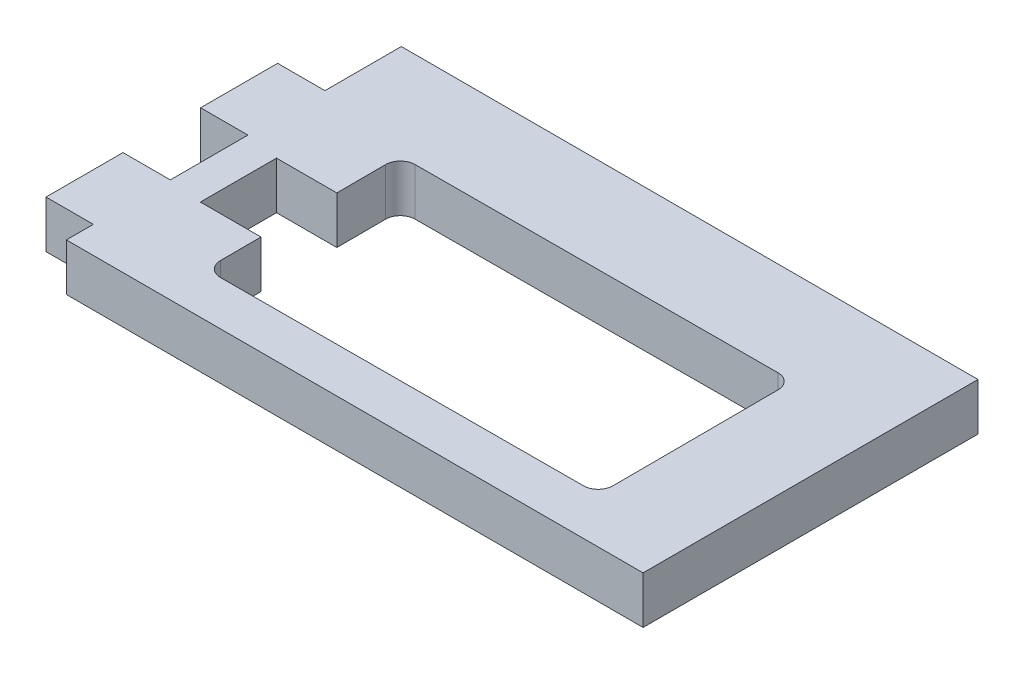
ISO-10303-21;
HEADER;
FILE_DESCRIPTION(('STEP AP214'),'2;1');
FILE_NAME('part.step','',(''),(''),'','','');
FILE_SCHEMA(('AUTOMOTIVE_DESIGN { 1 0 10303 214 1 1 1 1 }'));
ENDSEC;
DATA;
#1=APPLICATION_CONTEXT('core data for automotive mechanical design processes');
#2=APPLICATION_PROTOCOL_DEFINITION('international standard','automotive_design',2000,#1);
#3=PRODUCT_CONTEXT('',#1,'mechanical');
#4=PRODUCT('Part','Part','',(#3));
#5=PRODUCT_RELATED_PRODUCT_CATEGORY('part','',(#4));
#6=PRODUCT_DEFINITION_FORMATION('','',#4);
#7=PRODUCT_DEFINITION_CONTEXT('part definition',#1,'design');
#8=PRODUCT_DEFINITION('design','',#6,#7);
#9=PRODUCT_DEFINITION_SHAPE('','',#8);
#10=(LENGTH_UNIT() NAMED_UNIT(*) SI_UNIT(.MILLI.,.METRE.));
#11=(NAMED_UNIT(*) PLANE_ANGLE_UNIT() SI_UNIT($,.RADIAN.));
#12=(NAMED_UNIT(*) SI_UNIT($,.STERADIAN.) SOLID_ANGLE_UNIT());
#13=UNCERTAINTY_MEASURE_WITH_UNIT(LENGTH_MEASURE(1.E-05),#10,'distance_accuracy_value','');
#14=(GEOMETRIC_REPRESENTATION_CONTEXT(3) GLOBAL_UNCERTAINTY_ASSIGNED_CONTEXT((#13)) GLOBAL_UNIT_ASSIGNED_CONTEXT((#10,
#11,#12)) REPRESENTATION_CONTEXT('',''));
#15=CARTESIAN_POINT('',(0.,0.,0.));
#16=DIRECTION('',(0.,0.,1.));
#17=DIRECTION('',(1.,0.,0.));
#18=AXIS2_PLACEMENT_3D('',#15,#16,#17);
#19=CARTESIAN_POINT('',(60.7145244467132,0.,-0.194520655128441));
#20=DIRECTION('',(-0.999994867689621,0.,0.00320384057292232));
#21=DIRECTION('',(0.00320384057292232,0.,0.999994867689621));
#22=AXIS2_PLACEMENT_3D('',#19,#20,#21);
#23=PLANE('',#22);
#24=DIRECTION('',(0.00320384057292232,0.,0.999994867689622));
#25=VECTOR('',#24,1.);
#26=CARTESIAN_POINT('',(60.7145244467132,4.800000052,-0.194520655128441));
#27=LINE('',#26,#25);
#28=CARTESIAN_POINT('',(60.5113491104822,4.800000052,-63.6103769837103));
#29=VERTEX_POINT('',#28);
#30=CARTESIAN_POINT('',(60.5272366412184,4.800000052,-58.6515006492368));
#31=VERTEX_POINT('',#30);
#32=EDGE_CURVE('E277',#29,#31,#27,.T.);
#33=ORIENTED_EDGE('',*,*,#32,.T.);
#34=DIRECTION('',(0.,-1.,0.));
#35=VECTOR('',#34,1.);
#36=CARTESIAN_POINT('',(60.5272366412184,0.,-58.6515006492368));
#37=LINE('',#36,#35);
#38=CARTESIAN_POINT('',(60.5272366412184,0.,-58.6515006492368));
#39=VERTEX_POINT('',#38);
#40=EDGE_CURVE('E11',#31,#39,#37,.T.);
#41=ORIENTED_EDGE('',*,*,#40,.T.);
#42=DIRECTION('',(0.00320384057292232,0.,0.999994867689622));
#43=VECTOR('',#42,1.);
#44=CARTESIAN_POINT('',(60.7145244467132,0.,-0.194520655128441));
#45=LINE('',#44,#43);
#46=CARTESIAN_POINT('',(60.5113491104822,0.,-63.6103769837103));
#47=VERTEX_POINT('',#46);
#48=EDGE_CURVE('E253',#47,#39,#45,.T.);
#49=ORIENTED_EDGE('',*,*,#48,.F.);
#50=DIRECTION('',(0.,1.,0.));
#51=VECTOR('',#50,1.);
#52=CARTESIAN_POINT('',(60.5113491104822,0.,-63.6103769837103));
#53=LINE('',#52,#51);
#54=EDGE_CURVE('E286',#47,#29,#53,.T.);
#55=ORIENTED_EDGE('',*,*,#54,.T.);
#56=EDGE_LOOP('',(#33,#41,#49,#55));
#57=FACE_BOUND('',#56,.T.);
#58=ADVANCED_FACE('F34',(#57),#23,.F.);
#59=CARTESIAN_POINT('',(46.1381159723912,4.800000052,0.));
#60=DIRECTION('',(-1.,0.,0.));
#61=DIRECTION('',(0.,0.,1.));
#62=AXIS2_PLACEMENT_3D('',#59,#60,#61);
#63=PLANE('',#62);
#64=DIRECTION('',(0.,-1.,0.));
#65=VECTOR('',#64,1.);
#66=CARTESIAN_POINT('',(46.1381159723913,4.800000052,-59.2238942608691));
#67=LINE('',#66,#65);
#68=CARTESIAN_POINT('',(46.1381159723913,4.800000052,-59.2238942608691));
#69=VERTEX_POINT('',#68);
#70=CARTESIAN_POINT('',(46.1381159723913,0.,-59.2238942608691));
#71=VERTEX_POINT('',#70);
#72=EDGE_CURVE('E370',#69,#71,#67,.T.);
#73=ORIENTED_EDGE('',*,*,#72,.F.);
#74=DIRECTION('',(0.,0.,-1.));
#75=VECTOR('',#74,1.);
#76=CARTESIAN_POINT('',(46.1381159723912,4.800000052,0.));
#77=LINE('',#76,#75);
#78=CARTESIAN_POINT('',(46.1381159723912,4.800000052,-67.0356134608691));
#79=VERTEX_POINT('',#78);
#80=EDGE_CURVE('E223',#69,#79,#77,.T.);
#81=ORIENTED_EDGE('',*,*,#80,.T.);
#82=DIRECTION('',(0.,-1.,0.));
#83=VECTOR('',#82,1.);
#84=CARTESIAN_POINT('',(46.1381159723912,4.800000052,-67.0356134608691));
#85=LINE('',#84,#83);
#86=CARTESIAN_POINT('',(46.1381159723912,0.,-67.0356134608691));
#87=VERTEX_POINT('',#86);
#88=EDGE_CURVE('E389',#79,#87,#85,.T.);
#89=ORIENTED_EDGE('',*,*,#88,.T.);
#90=DIRECTION('',(0.,0.,-1.));
#91=VECTOR('',#90,1.);
#92=CARTESIAN_POINT('',(46.1381159723912,0.,0.));
#93=LINE('',#92,#91);
#94=EDGE_CURVE('E218',#71,#87,#93,.T.);
#95=ORIENTED_EDGE('',*,*,#94,.F.);
#96=EDGE_LOOP('',(#73,#81,#89,#95));
#97=FACE_BOUND('',#96,.T.);
#98=ADVANCED_FACE('F462',(#97),#63,.T.);
#99=CARTESIAN_POINT('',(0.,4.800000052,0.));
#100=DIRECTION('',(0.,-1.,0.));
#101=DIRECTION('',(0.,0.,-1.));
#102=AXIS2_PLACEMENT_3D('',#99,#100,#101);
#103=PLANE('',#102);
#104=DIRECTION('',(0.,0.,1.));
#105=VECTOR('',#104,1.);
#106=CARTESIAN_POINT('',(50.9381160243912,4.800000052,-35.7264558608691));
#107=LINE('',#106,#105);
#108=CARTESIAN_POINT('',(50.9381160243912,4.800000052,-43.5381750608691));
#109=VERTEX_POINT('',#108);
#110=CARTESIAN_POINT('',(50.9381160243912,4.800000052,-40.8064558608691));
#111=VERTEX_POINT('',#110);
#112=EDGE_CURVE('E337',#109,#111,#107,.T.);
#113=ORIENTED_EDGE('',*,*,#112,.T.);
#114=DIRECTION('',(-1.,0.,0.));
#115=VECTOR('',#114,1.);
#116=CARTESIAN_POINT('',(109.440687542804,4.800000052,-40.8064558608691));
#117=LINE('',#116,#115);
#118=CARTESIAN_POINT('',(109.440687542804,4.800000052,-40.8064558608691));
#119=VERTEX_POINT('',#118);
#120=EDGE_CURVE('E49',#119,#111,#117,.T.);
#121=ORIENTED_EDGE('',*,*,#120,.F.);
#122=DIRECTION('',(0.,0.,-1.));
#123=VECTOR('',#122,1.);
#124=CARTESIAN_POINT('',(109.440687542804,4.800000052,0.));
#125=LINE('',#124,#123);
#126=CARTESIAN_POINT('',(109.440687542804,4.800000052,-74.7850518608691));
#127=VERTEX_POINT('',#126);
#128=EDGE_CURVE('E209',#119,#127,#125,.T.);
#129=ORIENTED_EDGE('',*,*,#128,.T.);
#130=DIRECTION('',(1.,0.,0.));
#131=VECTOR('',#130,1.);
#132=CARTESIAN_POINT('',(0.,4.800000052,-74.7850518608691));
#133=LINE('',#132,#131);
#134=CARTESIAN_POINT('',(50.9381160243913,4.800000052,-74.7850518608691));
#135=VERTEX_POINT('',#134);
#136=EDGE_CURVE('E393',#135,#127,#133,.T.);
#137=ORIENTED_EDGE('',*,*,#136,.F.);
#138=DIRECTION('',(0.,0.,1.));
#139=VECTOR('',#138,1.);
#140=CARTESIAN_POINT('',(50.9381160243913,4.800000052,-67.0356134608691));
#141=LINE('',#140,#139);
#142=CARTESIAN_POINT('',(50.9381160243913,4.800000052,-67.0356134608691));
#143=VERTEX_POINT('',#142);
#144=EDGE_CURVE('E376',#135,#143,#141,.T.);
#145=ORIENTED_EDGE('',*,*,#144,.T.);
#146=DIRECTION('',(-1.,0.,0.));
#147=VECTOR('',#146,1.);
#148=CARTESIAN_POINT('',(50.9381160243913,4.800000052,-67.0356134608691));
#149=LINE('',#148,#147);
#150=EDGE_CURVE('E379',#143,#79,#149,.T.);
#151=ORIENTED_EDGE('',*,*,#150,.T.);
#152=ORIENTED_EDGE('',*,*,#80,.F.);
#153=DIRECTION('',(1.,0.,0.));
#154=VECTOR('',#153,1.);
#155=CARTESIAN_POINT('',(50.9381160243912,4.800000052,-59.2238942608691));
#156=LINE('',#155,#154);
#157=CARTESIAN_POINT('',(50.9381160243912,4.800000052,-59.2238942608691));
#158=VERTEX_POINT('',#157);
#159=EDGE_CURVE('E357',#69,#158,#156,.T.);
#160=ORIENTED_EDGE('',*,*,#159,.T.);
#161=DIRECTION('',(0.,0.,1.));
#162=VECTOR('',#161,1.);
#163=CARTESIAN_POINT('',(50.9381160243912,4.800000052,-51.3498942608691));
#164=LINE('',#163,#162);
#165=CARTESIAN_POINT('',(50.9381160243912,4.800000052,-51.3498942608691));
#166=VERTEX_POINT('',#165);
#167=EDGE_CURVE('E350',#158,#166,#164,.T.);
#168=ORIENTED_EDGE('',*,*,#167,.T.);
#169=DIRECTION('',(-1.,0.,0.));
#170=VECTOR('',#169,1.);
#171=CARTESIAN_POINT('',(50.9381160243912,4.800000052,-51.3498942608691));
#172=LINE('',#171,#170);
#173=CARTESIAN_POINT('',(46.1381159723913,4.800000052,-51.3498942608691));
#174=VERTEX_POINT('',#173);
#175=EDGE_CURVE('E353',#166,#174,#172,.T.);
#176=ORIENTED_EDGE('',*,*,#175,.T.);
#177=CARTESIAN_POINT('',(46.1381159723913,4.800000052,-43.5381750608691));
#178=VERTEX_POINT('',#177);
#179=EDGE_CURVE('E232',#178,#174,#77,.T.);
#180=ORIENTED_EDGE('',*,*,#179,.F.);
#181=DIRECTION('',(1.,0.,0.));
#182=VECTOR('',#181,1.);
#183=CARTESIAN_POINT('',(50.9381160243912,4.800000052,-43.5381750608691));
#184=LINE('',#183,#182);
#185=EDGE_CURVE('E340',#178,#109,#184,.T.);
#186=ORIENTED_EDGE('',*,*,#185,.T.);
#187=EDGE_LOOP('',(#113,#121,#129,#137,#145,#151,#152,#160,#168,#176,#180,#186));
#188=FACE_BOUND('',#187,.T.);
#189=DIRECTION('',(0.,0.,-1.));
#190=VECTOR('',#189,1.);
#191=CARTESIAN_POINT('',(54.4093293750469,4.800000052,-50.928800919992));
#192=LINE('',#191,#190);
#193=CARTESIAN_POINT('',(54.4093293750469,4.800000052,-50.928800919992));
#194=VERTEX_POINT('',#193);
#195=CARTESIAN_POINT('',(54.4093293750469,4.800000052,-58.6515006492368));
#196=VERTEX_POINT('',#195);
#197=EDGE_CURVE('E333',#194,#196,#192,.T.);
#198=ORIENTED_EDGE('',*,*,#197,.T.);
#199=DIRECTION('',(1.,0.,0.));
#200=VECTOR('',#199,1.);
#201=CARTESIAN_POINT('',(60.5519790669293,4.800000052,-58.6515006492368));
#202=LINE('',#201,#200);
#203=EDGE_CURVE('E328',#196,#31,#202,.T.);
#204=ORIENTED_EDGE('',*,*,#203,.T.);
#205=ORIENTED_EDGE('',*,*,#32,.F.);
#206=CARTESIAN_POINT('',(62.0112896697722,4.800000052,-63.615197718936));
#207=DIRECTION('',(0.,1.,0.));
#208=DIRECTION('',(0.,0.,1.));
#209=AXIS2_PLACEMENT_3D('',#206,#207,#208);
#210=CIRCLE('',#209,1.49994830607299);
#211=CARTESIAN_POINT('',(62.0064992145127,4.800000052,-65.1151383752386));
#212=VERTEX_POINT('',#211);
#213=EDGE_CURVE('E273',#212,#29,#210,.T.);
#214=ORIENTED_EDGE('',*,*,#213,.F.);
#215=DIRECTION('',(-0.999994867689621,0.,0.00320384057292975));
#216=VECTOR('',#215,1.);
#217=CARTESIAN_POINT('',(-0.207980979977878,4.800000052,-64.9158120763634));
#218=LINE('',#217,#216);
#219=CARTESIAN_POINT('',(98.7063766553041,4.800000052,-65.232719535068));
#220=VERTEX_POINT('',#219);
#221=EDGE_CURVE('E270',#220,#212,#218,.T.);
#222=ORIENTED_EDGE('',*,*,#221,.F.);
#223=CARTESIAN_POINT('',(98.7111973905267,4.800000052,-63.732778975778));
#224=DIRECTION('',(0.,1.,0.));
#225=DIRECTION('',(0.,0.,1.));
#226=AXIS2_PLACEMENT_3D('',#223,#224,#225);
#227=CIRCLE('',#226,1.49994830607303);
#228=CARTESIAN_POINT('',(100.211138046829,4.800000052,-63.7375694310304));
#229=VERTEX_POINT('',#228);
#230=EDGE_CURVE('E267',#229,#220,#227,.T.);
#231=ORIENTED_EDGE('',*,*,#230,.F.);
#232=DIRECTION('',(-0.00320384057292687,0.,-0.999994867689621));
#233=VECTOR('',#232,1.);
#234=CARTESIAN_POINT('',(100.414313383061,4.800000052,-0.321713102450738));
#235=LINE('',#234,#233);
#236=CARTESIAN_POINT('',(100.264962787065,4.800000052,-46.9375874202889));
#237=VERTEX_POINT('',#236);
#238=EDGE_CURVE('E264',#237,#229,#235,.T.);
#239=ORIENTED_EDGE('',*,*,#238,.F.);
#240=CARTESIAN_POINT('',(98.7650222277751,4.800000052,-46.9327666850652));
#241=DIRECTION('',(0.,1.,0.));
#242=DIRECTION('',(0.,0.,1.));
#243=AXIS2_PLACEMENT_3D('',#240,#241,#242);
#244=CIRCLE('',#243,1.49994830607302);
#245=CARTESIAN_POINT('',(98.7698126830331,4.800000052,-45.4328260287625));
#246=VERTEX_POINT('',#245);
#247=EDGE_CURVE('E261',#246,#237,#244,.T.);
#248=ORIENTED_EDGE('',*,*,#247,.F.);
#249=DIRECTION('',(0.999994867689621,0.,-0.00320384057292662));
#250=VECTOR('',#249,1.);
#251=CARTESIAN_POINT('',(-0.144544952249165,4.800000052,-45.1159185700582));
#252=LINE('',#251,#250);
#253=CARTESIAN_POINT('',(62.0699352422406,4.800000052,-45.3152448689332));
#254=VERTEX_POINT('',#253);
#255=EDGE_CURVE('E231',#254,#246,#252,.T.);
#256=ORIENTED_EDGE('',*,*,#255,.F.);
#257=CARTESIAN_POINT('',(62.0651145070206,4.800000052,-46.8151854282233));
#258=DIRECTION('',(0.,1.,0.));
#259=DIRECTION('',(0.,0.,1.));
#260=AXIS2_PLACEMENT_3D('',#257,#258,#259);
#261=CIRCLE('',#260,1.49994830607305);
#262=CARTESIAN_POINT('',(60.5651738507178,4.800000052,-46.8103949729689));
#263=VERTEX_POINT('',#262);
#264=EDGE_CURVE('E237',#263,#254,#261,.T.);
#265=ORIENTED_EDGE('',*,*,#264,.F.);
#266=CARTESIAN_POINT('',(60.5519790669293,4.800000052,-50.928800919992));
#267=VERTEX_POINT('',#266);
#268=EDGE_CURVE('E276',#267,#263,#27,.T.);
#269=ORIENTED_EDGE('',*,*,#268,.F.);
#270=DIRECTION('',(-1.,0.,0.));
#271=VECTOR('',#270,1.);
#272=CARTESIAN_POINT('',(60.5519790669293,4.800000052,-50.928800919992));
#273=LINE('',#272,#271);
#274=EDGE_CURVE('E57',#267,#194,#273,.T.);
#275=ORIENTED_EDGE('',*,*,#274,.T.);
#276=EDGE_LOOP('',(#198,#204,#205,#214,#222,#231,#239,#248,#256,#265,#269,#275));
#277=FACE_BOUND('',#276,.T.);
#278=ADVANCED_FACE('F307',(#188,#277),#103,.F.);
#279=CARTESIAN_POINT('',(0.,0.,0.));
#280=DIRECTION('',(0.,-1.,0.));
#281=DIRECTION('',(0.,0.,-1.));
#282=AXIS2_PLACEMENT_3D('',#279,#280,#281);
#283=PLANE('',#282);
#284=DIRECTION('',(-1.,0.,0.));
#285=VECTOR('',#284,1.);
#286=CARTESIAN_POINT('',(109.440687542804,0.,-40.8064558608691));
#287=LINE('',#286,#285);
#288=CARTESIAN_POINT('',(109.440687542804,0.,-40.8064558608691));
#289=VERTEX_POINT('',#288);
#290=CARTESIAN_POINT('',(50.9381160243912,0.,-40.8064558608691));
#291=VERTEX_POINT('',#290);
#292=EDGE_CURVE('E193',#289,#291,#287,.T.);
#293=ORIENTED_EDGE('',*,*,#292,.T.);
#294=DIRECTION('',(0.,0.,1.));
#295=VECTOR('',#294,1.);
#296=CARTESIAN_POINT('',(50.9381160243912,0.,-35.7264558608691));
#297=LINE('',#296,#295);
#298=CARTESIAN_POINT('',(50.9381160243912,0.,-43.5381750608691));
#299=VERTEX_POINT('',#298);
#300=EDGE_CURVE('E344',#299,#291,#297,.T.);
#301=ORIENTED_EDGE('',*,*,#300,.F.);
#302=DIRECTION('',(1.,0.,0.));
#303=VECTOR('',#302,1.);
#304=CARTESIAN_POINT('',(50.9381160243912,0.,-43.5381750608691));
#305=LINE('',#304,#303);
#306=CARTESIAN_POINT('',(46.1381159723913,0.,-43.5381750608691));
#307=VERTEX_POINT('',#306);
#308=EDGE_CURVE('E341',#307,#299,#305,.T.);
#309=ORIENTED_EDGE('',*,*,#308,.F.);
#310=CARTESIAN_POINT('',(46.1381159723913,0.,-51.3498942608691));
#311=VERTEX_POINT('',#310);
#312=EDGE_CURVE('E228',#307,#311,#93,.T.);
#313=ORIENTED_EDGE('',*,*,#312,.T.);
#314=DIRECTION('',(-1.,0.,0.));
#315=VECTOR('',#314,1.);
#316=CARTESIAN_POINT('',(50.9381160243912,0.,-51.3498942608691));
#317=LINE('',#316,#315);
#318=CARTESIAN_POINT('',(50.9381160243912,0.,-51.3498942608691));
#319=VERTEX_POINT('',#318);
#320=EDGE_CURVE('E364',#319,#311,#317,.T.);
#321=ORIENTED_EDGE('',*,*,#320,.F.);
#322=DIRECTION('',(0.,0.,1.));
#323=VECTOR('',#322,1.);
#324=CARTESIAN_POINT('',(50.9381160243912,0.,-51.3498942608691));
#325=LINE('',#324,#323);
#326=CARTESIAN_POINT('',(50.9381160243912,0.,-59.2238942608691));
#327=VERTEX_POINT('',#326);
#328=EDGE_CURVE('E361',#327,#319,#325,.T.);
#329=ORIENTED_EDGE('',*,*,#328,.F.);
#330=DIRECTION('',(1.,0.,0.));
#331=VECTOR('',#330,1.);
#332=CARTESIAN_POINT('',(50.9381160243912,0.,-59.2238942608691));
#333=LINE('',#332,#331);
#334=EDGE_CURVE('E354',#71,#327,#333,.T.);
#335=ORIENTED_EDGE('',*,*,#334,.F.);
#336=ORIENTED_EDGE('',*,*,#94,.T.);
#337=DIRECTION('',(-1.,0.,0.));
#338=VECTOR('',#337,1.);
#339=CARTESIAN_POINT('',(50.9381160243913,0.,-67.0356134608691));
#340=LINE('',#339,#338);
#341=CARTESIAN_POINT('',(50.9381160243913,0.,-67.0356134608691));
#342=VERTEX_POINT('',#341);
#343=EDGE_CURVE('E380',#342,#87,#340,.T.);
#344=ORIENTED_EDGE('',*,*,#343,.F.);
#345=DIRECTION('',(0.,0.,1.));
#346=VECTOR('',#345,1.);
#347=CARTESIAN_POINT('',(50.9381160243913,0.,-67.0356134608691));
#348=LINE('',#347,#346);
#349=CARTESIAN_POINT('',(50.9381160243913,0.,-74.7850518608691));
#350=VERTEX_POINT('',#349);
#351=EDGE_CURVE('E384',#350,#342,#348,.T.);
#352=ORIENTED_EDGE('',*,*,#351,.F.);
#353=DIRECTION('',(1.,0.,0.));
#354=VECTOR('',#353,1.);
#355=CARTESIAN_POINT('',(0.,0.,-74.7850518608691));
#356=LINE('',#355,#354);
#357=CARTESIAN_POINT('',(109.440687542804,0.,-74.7850518608691));
#358=VERTEX_POINT('',#357);
#359=EDGE_CURVE('E214',#350,#358,#356,.T.);
#360=ORIENTED_EDGE('',*,*,#359,.T.);
#361=DIRECTION('',(0.,0.,-1.));
#362=VECTOR('',#361,1.);
#363=CARTESIAN_POINT('',(109.440687542804,0.,0.));
#364=LINE('',#363,#362);
#365=EDGE_CURVE('E207',#289,#358,#364,.T.);
#366=ORIENTED_EDGE('',*,*,#365,.F.);
#367=EDGE_LOOP('',(#293,#301,#309,#313,#321,#329,#335,#336,#344,#352,#360,#366));
#368=FACE_BOUND('',#367,.T.);
#369=DIRECTION('',(1.,0.,0.));
#370=VECTOR('',#369,1.);
#371=CARTESIAN_POINT('',(60.5519790669293,0.,-58.6515006492368));
#372=LINE('',#371,#370);
#373=CARTESIAN_POINT('',(54.4093293750469,0.,-58.6515006492368));
#374=VERTEX_POINT('',#373);
#375=EDGE_CURVE('E428',#374,#39,#372,.T.);
#376=ORIENTED_EDGE('',*,*,#375,.F.);
#377=DIRECTION('',(0.,0.,-1.));
#378=VECTOR('',#377,1.);
#379=CARTESIAN_POINT('',(54.4093293750469,0.,-50.928800919992));
#380=LINE('',#379,#378);
#381=CARTESIAN_POINT('',(54.4093293750469,0.,-50.928800919992));
#382=VERTEX_POINT('',#381);
#383=EDGE_CURVE('E431',#382,#374,#380,.T.);
#384=ORIENTED_EDGE('',*,*,#383,.F.);
#385=DIRECTION('',(-1.,0.,0.));
#386=VECTOR('',#385,1.);
#387=CARTESIAN_POINT('',(60.5519790669293,0.,-50.928800919992));
#388=LINE('',#387,#386);
#389=CARTESIAN_POINT('',(60.5519790669293,0.,-50.928800919992));
#390=VERTEX_POINT('',#389);
#391=EDGE_CURVE('E425',#390,#382,#388,.T.);
#392=ORIENTED_EDGE('',*,*,#391,.F.);
#393=CARTESIAN_POINT('',(60.5651738507178,0.,-46.8103949729689));
#394=VERTEX_POINT('',#393);
#395=EDGE_CURVE('E252',#390,#394,#45,.T.);
#396=ORIENTED_EDGE('',*,*,#395,.T.);
#397=CARTESIAN_POINT('',(62.0651145070206,0.,-46.8151854282233));
#398=DIRECTION('',(0.,1.,0.));
#399=DIRECTION('',(0.,0.,1.));
#400=AXIS2_PLACEMENT_3D('',#397,#398,#399);
#401=CIRCLE('',#400,1.49994830607305);
#402=CARTESIAN_POINT('',(62.0699352422406,0.,-45.3152448689332));
#403=VERTEX_POINT('',#402);
#404=EDGE_CURVE('E256',#394,#403,#401,.T.);
#405=ORIENTED_EDGE('',*,*,#404,.T.);
#406=DIRECTION('',(0.999994867689621,0.,-0.00320384057292662));
#407=VECTOR('',#406,1.);
#408=CARTESIAN_POINT('',(-0.144544952249165,0.,-45.1159185700582));
#409=LINE('',#408,#407);
#410=CARTESIAN_POINT('',(98.7698126830331,0.,-45.4328260287625));
#411=VERTEX_POINT('',#410);
#412=EDGE_CURVE('E233',#403,#411,#409,.T.);
#413=ORIENTED_EDGE('',*,*,#412,.T.);
#414=CARTESIAN_POINT('',(98.7650222277751,0.,-46.9327666850652));
#415=DIRECTION('',(0.,1.,0.));
#416=DIRECTION('',(0.,0.,1.));
#417=AXIS2_PLACEMENT_3D('',#414,#415,#416);
#418=CIRCLE('',#417,1.49994830607302);
#419=CARTESIAN_POINT('',(100.264962787065,0.,-46.9375874202889));
#420=VERTEX_POINT('',#419);
#421=EDGE_CURVE('E236',#411,#420,#418,.T.);
#422=ORIENTED_EDGE('',*,*,#421,.T.);
#423=DIRECTION('',(-0.00320384057292687,0.,-0.999994867689621));
#424=VECTOR('',#423,1.);
#425=CARTESIAN_POINT('',(100.414313383061,0.,-0.321713102450738));
#426=LINE('',#425,#424);
#427=CARTESIAN_POINT('',(100.211138046829,0.,-63.7375694310304));
#428=VERTEX_POINT('',#427);
#429=EDGE_CURVE('E240',#420,#428,#426,.T.);
#430=ORIENTED_EDGE('',*,*,#429,.T.);
#431=CARTESIAN_POINT('',(98.7111973905267,0.,-63.732778975778));
#432=DIRECTION('',(0.,1.,0.));
#433=DIRECTION('',(0.,0.,1.));
#434=AXIS2_PLACEMENT_3D('',#431,#432,#433);
#435=CIRCLE('',#434,1.49994830607303);
#436=CARTESIAN_POINT('',(98.7063766553041,0.,-65.232719535068));
#437=VERTEX_POINT('',#436);
#438=EDGE_CURVE('E243',#428,#437,#435,.T.);
#439=ORIENTED_EDGE('',*,*,#438,.T.);
#440=DIRECTION('',(-0.999994867689621,0.,0.00320384057292975));
#441=VECTOR('',#440,1.);
#442=CARTESIAN_POINT('',(-0.207980979977878,0.,-64.9158120763634));
#443=LINE('',#442,#441);
#444=CARTESIAN_POINT('',(62.0064992145127,0.,-65.1151383752386));
#445=VERTEX_POINT('',#444);
#446=EDGE_CURVE('E246',#437,#445,#443,.T.);
#447=ORIENTED_EDGE('',*,*,#446,.T.);
#448=CARTESIAN_POINT('',(62.0112896697722,0.,-63.615197718936));
#449=DIRECTION('',(0.,1.,0.));
#450=DIRECTION('',(0.,0.,1.));
#451=AXIS2_PLACEMENT_3D('',#448,#449,#450);
#452=CIRCLE('',#451,1.49994830607299);
#453=EDGE_CURVE('E249',#445,#47,#452,.T.);
#454=ORIENTED_EDGE('',*,*,#453,.T.);
#455=ORIENTED_EDGE('',*,*,#48,.T.);
#456=EDGE_LOOP('',(#376,#384,#392,#396,#405,#413,#422,#430,#439,#447,#454,#455));
#457=FACE_BOUND('',#456,.T.);
#458=ADVANCED_FACE('F36',(#368,#457),#283,.T.);
#459=CARTESIAN_POINT('',(-0.144544952249165,0.,-45.1159185700582));
#460=DIRECTION('',(0.00320384057292662,0.,0.999994867689621));
#461=DIRECTION('',(0.999994867689621,0.,-0.00320384057292662));
#462=AXIS2_PLACEMENT_3D('',#459,#460,#461);
#463=PLANE('',#462);
#464=ORIENTED_EDGE('',*,*,#255,.T.);
#465=DIRECTION('',(0.,1.,0.));
#466=VECTOR('',#465,1.);
#467=CARTESIAN_POINT('',(98.7698126830331,0.,-45.4328260287625));
#468=LINE('',#467,#466);
#469=EDGE_CURVE('E259',#411,#246,#468,.T.);
#470=ORIENTED_EDGE('',*,*,#469,.F.);
#471=ORIENTED_EDGE('',*,*,#412,.F.);
#472=DIRECTION('',(0.,1.,0.));
#473=VECTOR('',#472,1.);
#474=CARTESIAN_POINT('',(62.0699352422406,0.,-45.3152448689332));
#475=LINE('',#474,#473);
#476=EDGE_CURVE('E42',#403,#254,#475,.T.);
#477=ORIENTED_EDGE('',*,*,#476,.T.);
#478=EDGE_LOOP('',(#464,#470,#471,#477));
#479=FACE_BOUND('',#478,.T.);
#480=ADVANCED_FACE('F316',(#479),#463,.F.);
#481=CARTESIAN_POINT('',(62.0651145070206,0.,-46.8151854282233));
#482=DIRECTION('',(0.,1.,0.));
#483=DIRECTION('',(0.,0.,1.));
#484=AXIS2_PLACEMENT_3D('',#481,#482,#483);
#485=CYLINDRICAL_SURFACE('',#484,1.49994830607305);
#486=ORIENTED_EDGE('',*,*,#264,.T.);
#487=ORIENTED_EDGE('',*,*,#476,.F.);
#488=ORIENTED_EDGE('',*,*,#404,.F.);
#489=DIRECTION('',(0.,1.,0.));
#490=VECTOR('',#489,1.);
#491=CARTESIAN_POINT('',(60.5651738507178,0.,-46.8103949729689));
#492=LINE('',#491,#490);
#493=EDGE_CURVE('E283',#394,#263,#492,.T.);
#494=ORIENTED_EDGE('',*,*,#493,.T.);
#495=EDGE_LOOP('',(#486,#487,#488,#494));
#496=FACE_BOUND('',#495,.T.);
#497=ADVANCED_FACE('F318',(#496),#485,.F.);
#498=ORIENTED_EDGE('',*,*,#395,.F.);
#499=DIRECTION('',(0.,-1.,0.));
#500=VECTOR('',#499,1.);
#501=CARTESIAN_POINT('',(60.5519790669293,4.800000052,-50.928800919992));
#502=LINE('',#501,#500);
#503=EDGE_CURVE('E324',#267,#390,#502,.T.);
#504=ORIENTED_EDGE('',*,*,#503,.F.);
#505=ORIENTED_EDGE('',*,*,#268,.T.);
#506=ORIENTED_EDGE('',*,*,#493,.F.);
#507=EDGE_LOOP('',(#498,#504,#505,#506));
#508=FACE_BOUND('',#507,.T.);
#509=ADVANCED_FACE('F323',(#508),#23,.F.);
#510=CARTESIAN_POINT('',(62.0112896697722,0.,-63.615197718936));
#511=DIRECTION('',(0.,1.,0.));
#512=DIRECTION('',(0.,0.,1.));
#513=AXIS2_PLACEMENT_3D('',#510,#511,#512);
#514=CYLINDRICAL_SURFACE('',#513,1.49994830607299);
#515=ORIENTED_EDGE('',*,*,#213,.T.);
#516=ORIENTED_EDGE('',*,*,#54,.F.);
#517=ORIENTED_EDGE('',*,*,#453,.F.);
#518=DIRECTION('',(0.,1.,0.));
#519=VECTOR('',#518,1.);
#520=CARTESIAN_POINT('',(62.0064992145127,0.,-65.1151383752386));
#521=LINE('',#520,#519);
#522=EDGE_CURVE('E288',#445,#212,#521,.T.);
#523=ORIENTED_EDGE('',*,*,#522,.T.);
#524=EDGE_LOOP('',(#515,#516,#517,#523));
#525=FACE_BOUND('',#524,.T.);
#526=ADVANCED_FACE('F447',(#525),#514,.F.);
#527=CARTESIAN_POINT('',(-0.207980979977878,0.,-64.9158120763634));
#528=DIRECTION('',(-0.00320384057292975,0.,-0.999994867689621));
#529=DIRECTION('',(-0.999994867689621,0.,0.00320384057292975));
#530=AXIS2_PLACEMENT_3D('',#527,#528,#529);
#531=PLANE('',#530);
#532=ORIENTED_EDGE('',*,*,#221,.T.);
#533=ORIENTED_EDGE('',*,*,#522,.F.);
#534=ORIENTED_EDGE('',*,*,#446,.F.);
#535=DIRECTION('',(0.,1.,0.));
#536=VECTOR('',#535,1.);
#537=CARTESIAN_POINT('',(98.7063766553041,0.,-65.232719535068));
#538=LINE('',#537,#536);
#539=EDGE_CURVE('E290',#437,#220,#538,.T.);
#540=ORIENTED_EDGE('',*,*,#539,.T.);
#541=EDGE_LOOP('',(#532,#533,#534,#540));
#542=FACE_BOUND('',#541,.T.);
#543=ADVANCED_FACE('F450',(#542),#531,.F.);
#544=CARTESIAN_POINT('',(98.7111973905267,0.,-63.732778975778));
#545=DIRECTION('',(0.,1.,0.));
#546=DIRECTION('',(0.,0.,1.));
#547=AXIS2_PLACEMENT_3D('',#544,#545,#546);
#548=CYLINDRICAL_SURFACE('',#547,1.49994830607303);
#549=ORIENTED_EDGE('',*,*,#230,.T.);
#550=ORIENTED_EDGE('',*,*,#539,.F.);
#551=ORIENTED_EDGE('',*,*,#438,.F.);
#552=DIRECTION('',(0.,1.,0.));
#553=VECTOR('',#552,1.);
#554=CARTESIAN_POINT('',(100.211138046829,0.,-63.7375694310304));
#555=LINE('',#554,#553);
#556=EDGE_CURVE('E292',#428,#229,#555,.T.);
#557=ORIENTED_EDGE('',*,*,#556,.T.);
#558=EDGE_LOOP('',(#549,#550,#551,#557));
#559=FACE_BOUND('',#558,.T.);
#560=ADVANCED_FACE('F452',(#559),#548,.F.);
#561=CARTESIAN_POINT('',(100.414313383061,0.,-0.321713102450738));
#562=DIRECTION('',(0.999994867689621,0.,-0.00320384057292686));
#563=DIRECTION('',(-0.00320384057292686,0.,-0.999994867689621));
#564=AXIS2_PLACEMENT_3D('',#561,#562,#563);
#565=PLANE('',#564);
#566=ORIENTED_EDGE('',*,*,#238,.T.);
#567=ORIENTED_EDGE('',*,*,#556,.F.);
#568=ORIENTED_EDGE('',*,*,#429,.F.);
#569=DIRECTION('',(0.,1.,0.));
#570=VECTOR('',#569,1.);
#571=CARTESIAN_POINT('',(100.264962787065,0.,-46.9375874202889));
#572=LINE('',#571,#570);
#573=EDGE_CURVE('E294',#420,#237,#572,.T.);
#574=ORIENTED_EDGE('',*,*,#573,.T.);
#575=EDGE_LOOP('',(#566,#567,#568,#574));
#576=FACE_BOUND('',#575,.T.);
#577=ADVANCED_FACE('F312',(#576),#565,.F.);
#578=CARTESIAN_POINT('',(98.7650222277751,0.,-46.9327666850652));
#579=DIRECTION('',(0.,1.,0.));
#580=DIRECTION('',(0.,0.,1.));
#581=AXIS2_PLACEMENT_3D('',#578,#579,#580);
#582=CYLINDRICAL_SURFACE('',#581,1.49994830607302);
#583=ORIENTED_EDGE('',*,*,#247,.T.);
#584=ORIENTED_EDGE('',*,*,#573,.F.);
#585=ORIENTED_EDGE('',*,*,#421,.F.);
#586=ORIENTED_EDGE('',*,*,#469,.T.);
#587=EDGE_LOOP('',(#583,#584,#585,#586));
#588=FACE_BOUND('',#587,.T.);
#589=ADVANCED_FACE('F299',(#588),#582,.F.);
#590=DIRECTION('',(0.,-1.,0.));
#591=VECTOR('',#590,1.);
#592=CARTESIAN_POINT('',(46.1381159723913,4.800000052,-43.5381750608691));
#593=LINE('',#592,#591);
#594=EDGE_CURVE('E220',#178,#307,#593,.T.);
#595=ORIENTED_EDGE('',*,*,#594,.F.);
#596=ORIENTED_EDGE('',*,*,#179,.T.);
#597=DIRECTION('',(0.,-1.,0.));
#598=VECTOR('',#597,1.);
#599=CARTESIAN_POINT('',(46.1381159723913,4.800000052,-51.3498942608691));
#600=LINE('',#599,#598);
#601=EDGE_CURVE('E372',#174,#311,#600,.T.);
#602=ORIENTED_EDGE('',*,*,#601,.T.);
#603=ORIENTED_EDGE('',*,*,#312,.F.);
#604=EDGE_LOOP('',(#595,#596,#602,#603));
#605=FACE_BOUND('',#604,.T.);
#606=ADVANCED_FACE('F406',(#605),#63,.T.);
#607=CARTESIAN_POINT('',(0.,4.800000052,-74.7850518608691));
#608=DIRECTION('',(0.,0.,-1.));
#609=DIRECTION('',(-1.,0.,0.));
#610=AXIS2_PLACEMENT_3D('',#607,#608,#609);
#611=PLANE('',#610);
#612=DIRECTION('',(0.,-1.,0.));
#613=VECTOR('',#612,1.);
#614=CARTESIAN_POINT('',(50.9381160243913,4.800000052,-74.7850518608691));
#615=LINE('',#614,#613);
#616=EDGE_CURVE('E365',#135,#350,#615,.T.);
#617=ORIENTED_EDGE('',*,*,#616,.F.);
#618=ORIENTED_EDGE('',*,*,#136,.T.);
#619=DIRECTION('',(0.,-1.,0.));
#620=VECTOR('',#619,1.);
#621=CARTESIAN_POINT('',(109.440687542804,4.800000052,-74.7850518608691));
#622=LINE('',#621,#620);
#623=EDGE_CURVE('E229',#127,#358,#622,.T.);
#624=ORIENTED_EDGE('',*,*,#623,.T.);
#625=ORIENTED_EDGE('',*,*,#359,.F.);
#626=EDGE_LOOP('',(#617,#618,#624,#625));
#627=FACE_BOUND('',#626,.T.);
#628=ADVANCED_FACE('F483',(#627),#611,.T.);
#629=CARTESIAN_POINT('',(109.440687542804,4.800000052,0.));
#630=DIRECTION('',(-1.,0.,0.));
#631=DIRECTION('',(0.,0.,1.));
#632=AXIS2_PLACEMENT_3D('',#629,#630,#631);
#633=PLANE('',#632);
#634=ORIENTED_EDGE('',*,*,#128,.F.);
#635=DIRECTION('',(0.,1.,0.));
#636=VECTOR('',#635,1.);
#637=CARTESIAN_POINT('',(109.440687542804,0.,-40.8064558608691));
#638=LINE('',#637,#636);
#639=EDGE_CURVE('E196',#289,#119,#638,.T.);
#640=ORIENTED_EDGE('',*,*,#639,.F.);
#641=ORIENTED_EDGE('',*,*,#365,.T.);
#642=ORIENTED_EDGE('',*,*,#623,.F.);
#643=EDGE_LOOP('',(#634,#640,#641,#642));
#644=FACE_BOUND('',#643,.T.);
#645=ADVANCED_FACE('F205',(#644),#633,.F.);
#646=CARTESIAN_POINT('',(50.9381160243913,4.800000052,-67.0356134608691));
#647=DIRECTION('',(1.,0.,0.));
#648=DIRECTION('',(0.,0.,-1.));
#649=AXIS2_PLACEMENT_3D('',#646,#647,#648);
#650=PLANE('',#649);
#651=ORIENTED_EDGE('',*,*,#351,.T.);
#652=DIRECTION('',(0.,-1.,0.));
#653=VECTOR('',#652,1.);
#654=CARTESIAN_POINT('',(50.9381160243913,4.800000052,-67.0356134608691));
#655=LINE('',#654,#653);
#656=EDGE_CURVE('E383',#143,#342,#655,.T.);
#657=ORIENTED_EDGE('',*,*,#656,.F.);
#658=ORIENTED_EDGE('',*,*,#144,.F.);
#659=ORIENTED_EDGE('',*,*,#616,.T.);
#660=EDGE_LOOP('',(#651,#657,#658,#659));
#661=FACE_BOUND('',#660,.T.);
#662=ADVANCED_FACE('F482',(#661),#650,.F.);
#663=CARTESIAN_POINT('',(50.9381160243913,4.800000052,-67.0356134608691));
#664=DIRECTION('',(0.,0.,1.));
#665=DIRECTION('',(1.,0.,0.));
#666=AXIS2_PLACEMENT_3D('',#663,#664,#665);
#667=PLANE('',#666);
#668=ORIENTED_EDGE('',*,*,#343,.T.);
#669=ORIENTED_EDGE('',*,*,#88,.F.);
#670=ORIENTED_EDGE('',*,*,#150,.F.);
#671=ORIENTED_EDGE('',*,*,#656,.T.);
#672=EDGE_LOOP('',(#668,#669,#670,#671));
#673=FACE_BOUND('',#672,.T.);
#674=ADVANCED_FACE('F489',(#673),#667,.F.);
#675=CARTESIAN_POINT('',(50.9381160243912,4.800000052,-51.3498942608691));
#676=DIRECTION('',(1.,0.,0.));
#677=DIRECTION('',(0.,0.,-1.));
#678=AXIS2_PLACEMENT_3D('',#675,#676,#677);
#679=PLANE('',#678);
#680=ORIENTED_EDGE('',*,*,#328,.T.);
#681=DIRECTION('',(0.,-1.,0.));
#682=VECTOR('',#681,1.);
#683=CARTESIAN_POINT('',(50.9381160243912,4.800000052,-51.3498942608691));
#684=LINE('',#683,#682);
#685=EDGE_CURVE('E360',#166,#319,#684,.T.);
#686=ORIENTED_EDGE('',*,*,#685,.F.);
#687=ORIENTED_EDGE('',*,*,#167,.F.);
#688=DIRECTION('',(0.,-1.,0.));
#689=VECTOR('',#688,1.);
#690=CARTESIAN_POINT('',(50.9381160243912,4.800000052,-59.2238942608691));
#691=LINE('',#690,#689);
#692=EDGE_CURVE('E346',#158,#327,#691,.T.);
#693=ORIENTED_EDGE('',*,*,#692,.T.);
#694=EDGE_LOOP('',(#680,#686,#687,#693));
#695=FACE_BOUND('',#694,.T.);
#696=ADVANCED_FACE('F493',(#695),#679,.F.);
#697=CARTESIAN_POINT('',(50.9381160243912,4.800000052,-59.2238942608691));
#698=DIRECTION('',(0.,0.,-1.));
#699=DIRECTION('',(-1.,0.,0.));
#700=AXIS2_PLACEMENT_3D('',#697,#698,#699);
#701=PLANE('',#700);
#702=ORIENTED_EDGE('',*,*,#334,.T.);
#703=ORIENTED_EDGE('',*,*,#692,.F.);
#704=ORIENTED_EDGE('',*,*,#159,.F.);
#705=ORIENTED_EDGE('',*,*,#72,.T.);
#706=EDGE_LOOP('',(#702,#703,#704,#705));
#707=FACE_BOUND('',#706,.T.);
#708=ADVANCED_FACE('F497',(#707),#701,.F.);
#709=CARTESIAN_POINT('',(50.9381160243912,4.800000052,-51.3498942608691));
#710=DIRECTION('',(0.,0.,1.));
#711=DIRECTION('',(1.,0.,0.));
#712=AXIS2_PLACEMENT_3D('',#709,#710,#711);
#713=PLANE('',#712);
#714=ORIENTED_EDGE('',*,*,#320,.T.);
#715=ORIENTED_EDGE('',*,*,#601,.F.);
#716=ORIENTED_EDGE('',*,*,#175,.F.);
#717=ORIENTED_EDGE('',*,*,#685,.T.);
#718=EDGE_LOOP('',(#714,#715,#716,#717));
#719=FACE_BOUND('',#718,.T.);
#720=ADVANCED_FACE('F413',(#719),#713,.F.);
#721=CARTESIAN_POINT('',(50.9381160243912,4.800000052,-35.7264558608691));
#722=DIRECTION('',(1.,0.,0.));
#723=DIRECTION('',(0.,0.,-1.));
#724=AXIS2_PLACEMENT_3D('',#721,#722,#723);
#725=PLANE('',#724);
#726=ORIENTED_EDGE('',*,*,#300,.T.);
#727=DIRECTION('',(0.,1.,0.));
#728=VECTOR('',#727,1.);
#729=CARTESIAN_POINT('',(50.9381160243912,0.,-40.8064558608691));
#730=LINE('',#729,#728);
#731=EDGE_CURVE('E197',#291,#111,#730,.T.);
#732=ORIENTED_EDGE('',*,*,#731,.T.);
#733=ORIENTED_EDGE('',*,*,#112,.F.);
#734=DIRECTION('',(0.,-1.,0.));
#735=VECTOR('',#734,1.);
#736=CARTESIAN_POINT('',(50.9381160243912,4.800000052,-43.5381750608691));
#737=LINE('',#736,#735);
#738=EDGE_CURVE('E216',#109,#299,#737,.T.);
#739=ORIENTED_EDGE('',*,*,#738,.T.);
#740=EDGE_LOOP('',(#726,#732,#733,#739));
#741=FACE_BOUND('',#740,.T.);
#742=ADVANCED_FACE('F422',(#741),#725,.F.);
#743=CARTESIAN_POINT('',(50.9381160243912,4.800000052,-43.5381750608691));
#744=DIRECTION('',(0.,0.,-1.));
#745=DIRECTION('',(-1.,0.,0.));
#746=AXIS2_PLACEMENT_3D('',#743,#744,#745);
#747=PLANE('',#746);
#748=ORIENTED_EDGE('',*,*,#308,.T.);
#749=ORIENTED_EDGE('',*,*,#738,.F.);
#750=ORIENTED_EDGE('',*,*,#185,.F.);
#751=ORIENTED_EDGE('',*,*,#594,.T.);
#752=EDGE_LOOP('',(#748,#749,#750,#751));
#753=FACE_BOUND('',#752,.T.);
#754=ADVANCED_FACE('F419',(#753),#747,.F.);
#755=CARTESIAN_POINT('',(60.5519790669293,4.800000052,-58.6515006492368));
#756=DIRECTION('',(0.,0.,-1.));
#757=DIRECTION('',(-1.,0.,0.));
#758=AXIS2_PLACEMENT_3D('',#755,#756,#757);
#759=PLANE('',#758);
#760=ORIENTED_EDGE('',*,*,#203,.F.);
#761=DIRECTION('',(0.,-1.,0.));
#762=VECTOR('',#761,1.);
#763=CARTESIAN_POINT('',(54.4093293750469,4.800000052,-58.6515006492368));
#764=LINE('',#763,#762);
#765=EDGE_CURVE('E330',#196,#374,#764,.T.);
#766=ORIENTED_EDGE('',*,*,#765,.T.);
#767=ORIENTED_EDGE('',*,*,#375,.T.);
#768=ORIENTED_EDGE('',*,*,#40,.F.);
#769=EDGE_LOOP('',(#760,#766,#767,#768));
#770=FACE_BOUND('',#769,.T.);
#771=ADVANCED_FACE('F436',(#770),#759,.F.);
#772=CARTESIAN_POINT('',(54.4093293750469,4.800000052,-50.928800919992));
#773=DIRECTION('',(-1.,0.,0.));
#774=DIRECTION('',(0.,0.,1.));
#775=AXIS2_PLACEMENT_3D('',#772,#773,#774);
#776=PLANE('',#775);
#777=ORIENTED_EDGE('',*,*,#383,.T.);
#778=ORIENTED_EDGE('',*,*,#765,.F.);
#779=ORIENTED_EDGE('',*,*,#197,.F.);
#780=DIRECTION('',(0.,-1.,0.));
#781=VECTOR('',#780,1.);
#782=CARTESIAN_POINT('',(54.4093293750469,4.800000052,-50.928800919992));
#783=LINE('',#782,#781);
#784=EDGE_CURVE('E327',#194,#382,#783,.T.);
#785=ORIENTED_EDGE('',*,*,#784,.T.);
#786=EDGE_LOOP('',(#777,#778,#779,#785));
#787=FACE_BOUND('',#786,.T.);
#788=ADVANCED_FACE('F440',(#787),#776,.F.);
#789=CARTESIAN_POINT('',(60.5519790669293,4.800000052,-50.928800919992));
#790=DIRECTION('',(0.,0.,1.));
#791=DIRECTION('',(1.,0.,0.));
#792=AXIS2_PLACEMENT_3D('',#789,#790,#791);
#793=PLANE('',#792);
#794=ORIENTED_EDGE('',*,*,#391,.T.);
#795=ORIENTED_EDGE('',*,*,#784,.F.);
#796=ORIENTED_EDGE('',*,*,#274,.F.);
#797=ORIENTED_EDGE('',*,*,#503,.T.);
#798=EDGE_LOOP('',(#794,#795,#796,#797));
#799=FACE_BOUND('',#798,.T.);
#800=ADVANCED_FACE('F508',(#799),#793,.F.);
#801=CARTESIAN_POINT('',(109.440687542804,0.,-40.8064558608691));
#802=DIRECTION('',(0.,0.,-1.));
#803=DIRECTION('',(-1.,0.,0.));
#804=AXIS2_PLACEMENT_3D('',#801,#802,#803);
#805=PLANE('',#804);
#806=ORIENTED_EDGE('',*,*,#120,.T.);
#807=ORIENTED_EDGE('',*,*,#731,.F.);
#808=ORIENTED_EDGE('',*,*,#292,.F.);
#809=ORIENTED_EDGE('',*,*,#639,.T.);
#810=EDGE_LOOP('',(#806,#807,#808,#809));
#811=FACE_BOUND('',#810,.T.);
#812=ADVANCED_FACE('F195',(#811),#805,.F.);
#813=CLOSED_SHELL('',(#58,#98,#278,#458,#480,#497,#509,#526,#543,#560,#577,#589,#606,#628,#645,
#662,#674,#696,#708,#720,#742,#754,#771,#788,#800,#812));
#814=MANIFOLD_SOLID_BREP('B2',#813);
#815=ADVANCED_BREP_SHAPE_REPRESENTATION('',(#18,#814),#14);
#816=SHAPE_DEFINITION_REPRESENTATION(#9,#815);
ENDSEC;
END-ISO-10303-21;
